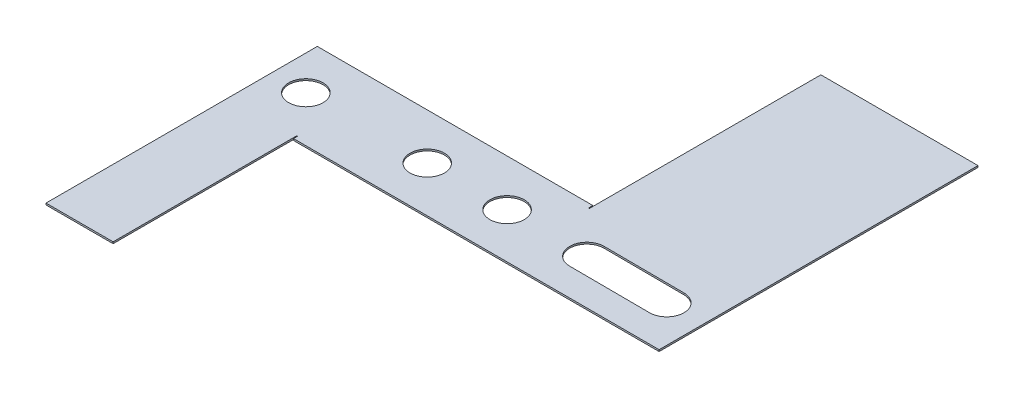
ISO-10303-21;
HEADER;
FILE_DESCRIPTION(('STEP AP214'),'2;1');
FILE_NAME('part.step','',(''),(''),'','','');
FILE_SCHEMA(('AUTOMOTIVE_DESIGN { 1 0 10303 214 1 1 1 1 }'));
ENDSEC;
DATA;
#1=APPLICATION_CONTEXT('core data for automotive mechanical design processes');
#2=APPLICATION_PROTOCOL_DEFINITION('international standard','automotive_design',2000,#1);
#3=PRODUCT_CONTEXT('',#1,'mechanical');
#4=PRODUCT('Part','Part','',(#3));
#5=PRODUCT_RELATED_PRODUCT_CATEGORY('part','',(#4));
#6=PRODUCT_DEFINITION_FORMATION('','',#4);
#7=PRODUCT_DEFINITION_CONTEXT('part definition',#1,'design');
#8=PRODUCT_DEFINITION('design','',#6,#7);
#9=PRODUCT_DEFINITION_SHAPE('','',#8);
#10=(LENGTH_UNIT() NAMED_UNIT(*) SI_UNIT(.MILLI.,.METRE.));
#11=(NAMED_UNIT(*) PLANE_ANGLE_UNIT() SI_UNIT($,.RADIAN.));
#12=(NAMED_UNIT(*) SI_UNIT($,.STERADIAN.) SOLID_ANGLE_UNIT());
#13=UNCERTAINTY_MEASURE_WITH_UNIT(LENGTH_MEASURE(1.E-05),#10,'distance_accuracy_value','');
#14=(GEOMETRIC_REPRESENTATION_CONTEXT(3) GLOBAL_UNCERTAINTY_ASSIGNED_CONTEXT((#13)) GLOBAL_UNIT_ASSIGNED_CONTEXT((#10,
#11,#12)) REPRESENTATION_CONTEXT('',''));
#15=CARTESIAN_POINT('',(0.,0.,0.));
#16=DIRECTION('',(0.,0.,1.));
#17=DIRECTION('',(1.,0.,0.));
#18=AXIS2_PLACEMENT_3D('',#15,#16,#17);
#19=CARTESIAN_POINT('',(10.4742271385243,60.7366,40.));
#20=DIRECTION('',(0.,0.,1.));
#21=DIRECTION('',(0.,-1.,0.));
#22=AXIS2_PLACEMENT_3D('',#19,#20,#21);
#23=PLANE('',#22);
#24=DIRECTION('',(0.,1.,0.));
#25=VECTOR('',#24,1.);
#26=CARTESIAN_POINT('',(10.5818542770486,59.2634,40.));
#27=LINE('',#26,#25);
#28=CARTESIAN_POINT('',(10.5818542770486,59.2634,40.));
#29=VERTEX_POINT('',#28);
#30=CARTESIAN_POINT('',(10.5818542770486,60.,40.));
#31=VERTEX_POINT('',#30);
#32=EDGE_CURVE('E217',#29,#31,#27,.T.);
#33=ORIENTED_EDGE('',*,*,#32,.F.);
#34=DIRECTION('',(1.,0.,0.));
#35=VECTOR('',#34,1.);
#36=CARTESIAN_POINT('',(11.2108271385243,59.2634,40.));
#37=LINE('',#36,#35);
#38=CARTESIAN_POINT('',(170.,59.2634,40.));
#39=VERTEX_POINT('',#38);
#40=EDGE_CURVE('E12',#29,#39,#37,.T.);
#41=ORIENTED_EDGE('',*,*,#40,.T.);
#42=DIRECTION('',(0.,-1.,0.));
#43=VECTOR('',#42,1.);
#44=CARTESIAN_POINT('',(170.,60.,40.));
#45=LINE('',#44,#43);
#46=CARTESIAN_POINT('',(170.,60.,40.));
#47=VERTEX_POINT('',#46);
#48=EDGE_CURVE('E239',#47,#39,#45,.T.);
#49=ORIENTED_EDGE('',*,*,#48,.F.);
#50=DIRECTION('',(1.,0.,0.));
#51=VECTOR('',#50,1.);
#52=CARTESIAN_POINT('',(11.2108271385243,60.,40.));
#53=LINE('',#52,#51);
#54=EDGE_CURVE('E77',#31,#47,#53,.T.);
#55=ORIENTED_EDGE('',*,*,#54,.F.);
#56=EDGE_LOOP('',(#33,#41,#49,#55));
#57=FACE_BOUND('',#56,.T.);
#58=ADVANCED_FACE('F66',(#57),#23,.T.);
#59=CARTESIAN_POINT('',(30.4742271385243,58.5268,0.));
#60=DIRECTION('',(0.,0.,-1.));
#61=DIRECTION('',(0.,1.,0.));
#62=AXIS2_PLACEMENT_3D('',#59,#60,#61);
#63=PLANE('',#62);
#64=DIRECTION('',(1.,0.,0.));
#65=VECTOR('',#64,1.);
#66=CARTESIAN_POINT('',(11.2108271385243,60.,0.));
#67=LINE('',#66,#65);
#68=CARTESIAN_POINT('',(-19.0515457229514,60.,0.));
#69=VERTEX_POINT('',#68);
#70=CARTESIAN_POINT('',(101.1049,60.,0.));
#71=VERTEX_POINT('',#70);
#72=EDGE_CURVE('E266',#69,#71,#67,.T.);
#73=ORIENTED_EDGE('',*,*,#72,.T.);
#74=DIRECTION('',(0.,-1.,0.));
#75=VECTOR('',#74,1.);
#76=CARTESIAN_POINT('',(101.1049,60.,0.));
#77=LINE('',#76,#75);
#78=CARTESIAN_POINT('',(101.1049,59.2634,0.));
#79=VERTEX_POINT('',#78);
#80=EDGE_CURVE('E289',#71,#79,#77,.T.);
#81=ORIENTED_EDGE('',*,*,#80,.T.);
#82=DIRECTION('',(1.,0.,0.));
#83=VECTOR('',#82,1.);
#84=CARTESIAN_POINT('',(11.2108271385243,59.2634,0.));
#85=LINE('',#84,#83);
#86=CARTESIAN_POINT('',(-19.0515457229514,59.2634,0.));
#87=VERTEX_POINT('',#86);
#88=EDGE_CURVE('E70',#87,#79,#85,.T.);
#89=ORIENTED_EDGE('',*,*,#88,.F.);
#90=DIRECTION('',(0.,1.,0.));
#91=VECTOR('',#90,1.);
#92=CARTESIAN_POINT('',(-19.0515457229514,59.2634,0.));
#93=LINE('',#92,#91);
#94=EDGE_CURVE('E267',#87,#69,#93,.T.);
#95=ORIENTED_EDGE('',*,*,#94,.T.);
#96=EDGE_LOOP('',(#73,#81,#89,#95));
#97=FACE_BOUND('',#96,.T.);
#98=ADVANCED_FACE('F304',(#97),#63,.T.);
#99=CARTESIAN_POINT('',(30.,60.,40.));
#100=DIRECTION('',(0.,1.,0.));
#101=DIRECTION('',(-1.,0.,0.));
#102=AXIS2_PLACEMENT_3D('',#99,#100,#101);
#103=PLANE('',#102);
#104=DIRECTION('',(0.,-5.23236669128384E-13,-1.));
#105=VECTOR('',#104,1.);
#106=CARTESIAN_POINT('',(10.2118542770486,59.9999999999993,78.3149457229708));
#107=LINE('',#106,#105);
#108=CARTESIAN_POINT('',(10.2118542770486,60.0000000000202,118.314945722971));
#109=VERTEX_POINT('',#108);
#110=CARTESIAN_POINT('',(10.2118542770486,60.,38.16));
#111=VERTEX_POINT('',#110);
#112=EDGE_CURVE('E104',#109,#111,#107,.T.);
#113=ORIENTED_EDGE('',*,*,#112,.T.);
#114=DIRECTION('',(-1.,0.,0.));
#115=VECTOR('',#114,1.);
#116=CARTESIAN_POINT('',(10.2118542770486,60.,38.16));
#117=LINE('',#116,#115);
#118=CARTESIAN_POINT('',(10.5818542770486,60.,38.16));
#119=VERTEX_POINT('',#118);
#120=EDGE_CURVE('E222',#119,#111,#117,.T.);
#121=ORIENTED_EDGE('',*,*,#120,.F.);
#122=DIRECTION('',(0.,0.,-1.));
#123=VECTOR('',#122,1.);
#124=CARTESIAN_POINT('',(10.5818542770486,60.,40.));
#125=LINE('',#124,#123);
#126=EDGE_CURVE('E757',#31,#119,#125,.T.);
#127=ORIENTED_EDGE('',*,*,#126,.F.);
#128=ORIENTED_EDGE('',*,*,#54,.T.);
#129=DIRECTION('',(3.904092677644E-13,0.,1.));
#130=VECTOR('',#129,1.);
#131=CARTESIAN_POINT('',(170.,60.,-99.0515457229342));
#132=LINE('',#131,#130);
#133=CARTESIAN_POINT('',(170.,60.,-99.0515457229342));
#134=VERTEX_POINT('',#133);
#135=EDGE_CURVE('E242',#134,#47,#132,.T.);
#136=ORIENTED_EDGE('',*,*,#135,.F.);
#137=DIRECTION('',(-1.,0.,0.));
#138=VECTOR('',#137,1.);
#139=CARTESIAN_POINT('',(170.,60.,-99.0515457229342));
#140=LINE('',#139,#138);
#141=CARTESIAN_POINT('',(101.4732,60.,-99.0515457229342));
#142=VERTEX_POINT('',#141);
#143=EDGE_CURVE('E235',#134,#142,#140,.T.);
#144=ORIENTED_EDGE('',*,*,#143,.T.);
#145=DIRECTION('',(0.,0.,-1.));
#146=VECTOR('',#145,1.);
#147=CARTESIAN_POINT('',(101.4732,60.,-99.0515457229342));
#148=LINE('',#147,#146);
#149=CARTESIAN_POINT('',(101.4732,60.,1.8415));
#150=VERTEX_POINT('',#149);
#151=EDGE_CURVE('E259',#150,#142,#148,.T.);
#152=ORIENTED_EDGE('',*,*,#151,.F.);
#153=DIRECTION('',(-1.,0.,0.));
#154=VECTOR('',#153,1.);
#155=CARTESIAN_POINT('',(101.4732,60.,1.8415));
#156=LINE('',#155,#154);
#157=CARTESIAN_POINT('',(101.1049,60.,1.8415));
#158=VERTEX_POINT('',#157);
#159=EDGE_CURVE('E332',#150,#158,#156,.T.);
#160=ORIENTED_EDGE('',*,*,#159,.T.);
#161=DIRECTION('',(0.,0.,-1.));
#162=VECTOR('',#161,1.);
#163=CARTESIAN_POINT('',(101.1049,60.,1.8415));
#164=LINE('',#163,#162);
#165=EDGE_CURVE('E329',#158,#71,#164,.T.);
#166=ORIENTED_EDGE('',*,*,#165,.T.);
#167=ORIENTED_EDGE('',*,*,#72,.F.);
#168=DIRECTION('',(0.,5.23236669128384E-13,1.));
#169=VECTOR('',#168,1.);
#170=CARTESIAN_POINT('',(-19.0515457229514,59.9999999999993,78.3149457229708));
#171=LINE('',#170,#169);
#172=CARTESIAN_POINT('',(-19.0515457229514,60.0000000000202,118.314945722971));
#173=VERTEX_POINT('',#172);
#174=EDGE_CURVE('E276',#69,#173,#171,.T.);
#175=ORIENTED_EDGE('',*,*,#174,.T.);
#176=DIRECTION('',(1.,0.,0.));
#177=VECTOR('',#176,1.);
#178=CARTESIAN_POINT('',(-19.0515457229514,60.0000000000202,118.314945722971));
#179=LINE('',#178,#177);
#180=EDGE_CURVE('E111',#173,#109,#179,.T.);
#181=ORIENTED_EDGE('',*,*,#180,.T.);
#182=EDGE_LOOP('',(#113,#121,#127,#128,#136,#144,#152,#160,#166,#167,#175,#181));
#183=FACE_BOUND('',#182,.T.);
#184=CARTESIAN_POINT('',(-4.05154572295137,60.,20.));
#185=DIRECTION('',(0.,1.,0.));
#186=DIRECTION('',(-1.,0.,0.));
#187=AXIS2_PLACEMENT_3D('',#184,#185,#186);
#188=CIRCLE('',#187,7.5);
#189=CARTESIAN_POINT('',(-11.5515457229514,60.,20.));
#190=VERTEX_POINT('',#189);
#191=EDGE_CURVE('E269',#190,#190,#188,.T.);
#192=ORIENTED_EDGE('',*,*,#191,.F.);
#193=EDGE_LOOP('',(#192));
#194=FACE_BOUND('',#193,.T.);
#195=CARTESIAN_POINT('',(48.9732,60.,20.0930541960112));
#196=DIRECTION('',(0.,1.,0.));
#197=DIRECTION('',(-1.,0.,0.));
#198=AXIS2_PLACEMENT_3D('',#195,#196,#197);
#199=CIRCLE('',#198,7.5);
#200=CARTESIAN_POINT('',(41.4732,60.,20.0930541960112));
#201=VERTEX_POINT('',#200);
#202=EDGE_CURVE('E336',#201,#201,#199,.T.);
#203=ORIENTED_EDGE('',*,*,#202,.F.);
#204=EDGE_LOOP('',(#203));
#205=FACE_BOUND('',#204,.T.);
#206=CARTESIAN_POINT('',(83.9732,60.,20.2791625880335));
#207=DIRECTION('',(0.,1.,0.));
#208=DIRECTION('',(-1.,0.,0.));
#209=AXIS2_PLACEMENT_3D('',#206,#207,#208);
#210=CIRCLE('',#209,7.50000000000001);
#211=CARTESIAN_POINT('',(76.4732,60.,20.2791625880335));
#212=VERTEX_POINT('',#211);
#213=EDGE_CURVE('E339',#212,#212,#210,.T.);
#214=ORIENTED_EDGE('',*,*,#213,.F.);
#215=EDGE_LOOP('',(#214));
#216=FACE_BOUND('',#215,.T.);
#217=CARTESIAN_POINT('',(118.9732,60.,20.4652709800558));
#218=DIRECTION('',(0.,1.,0.));
#219=DIRECTION('',(-1.,0.,0.));
#220=AXIS2_PLACEMENT_3D('',#217,#218,#219);
#221=CIRCLE('',#220,7.5);
#222=CARTESIAN_POINT('',(119.013079805931,60.,12.9653770074));
#223=VERTEX_POINT('',#222);
#224=CARTESIAN_POINT('',(118.933320194069,60.,27.9651649527117));
#225=VERTEX_POINT('',#224);
#226=EDGE_CURVE('E342',#223,#225,#221,.T.);
#227=ORIENTED_EDGE('',*,*,#226,.F.);
#228=DIRECTION('',(-0.999985863020774,0.,-0.00531730745748192));
#229=VECTOR('',#228,1.);
#230=CARTESIAN_POINT('',(119.013079805931,60.,12.9653770074));
#231=LINE('',#230,#229);
#232=CARTESIAN_POINT('',(154.013079805931,60.,13.1514853994224));
#233=VERTEX_POINT('',#232);
#234=EDGE_CURVE('E348',#233,#223,#231,.T.);
#235=ORIENTED_EDGE('',*,*,#234,.F.);
#236=CARTESIAN_POINT('',(153.9732,60.,20.6513793720782));
#237=DIRECTION('',(0.,1.,0.));
#238=DIRECTION('',(-1.,0.,0.));
#239=AXIS2_PLACEMENT_3D('',#236,#237,#238);
#240=CIRCLE('',#239,7.5);
#241=CARTESIAN_POINT('',(153.933320194069,60.,28.151273344734));
#242=VERTEX_POINT('',#241);
#243=EDGE_CURVE('E354',#242,#233,#240,.T.);
#244=ORIENTED_EDGE('',*,*,#243,.F.);
#245=DIRECTION('',(0.999985863020774,0.,0.00531730745748202));
#246=VECTOR('',#245,1.);
#247=CARTESIAN_POINT('',(118.933320194069,60.,27.9651649527117));
#248=LINE('',#247,#246);
#249=EDGE_CURVE('E359',#225,#242,#248,.T.);
#250=ORIENTED_EDGE('',*,*,#249,.F.);
#251=EDGE_LOOP('',(#227,#235,#244,#250));
#252=FACE_BOUND('',#251,.T.);
#253=ADVANCED_FACE('F68',(#183,#194,#205,#216,#252),#103,.T.);
#254=CARTESIAN_POINT('',(11.2108271385243,59.2634,40.));
#255=DIRECTION('',(0.,1.,0.));
#256=DIRECTION('',(-1.,0.,0.));
#257=AXIS2_PLACEMENT_3D('',#254,#255,#256);
#258=PLANE('',#257);
#259=DIRECTION('',(-1.,0.,0.));
#260=VECTOR('',#259,1.);
#261=CARTESIAN_POINT('',(10.2118542770486,59.2634,38.16));
#262=LINE('',#261,#260);
#263=CARTESIAN_POINT('',(10.5818542770486,59.2634,38.16));
#264=VERTEX_POINT('',#263);
#265=CARTESIAN_POINT('',(10.2118542770486,59.2634,38.16));
#266=VERTEX_POINT('',#265);
#267=EDGE_CURVE('E221',#264,#266,#262,.T.);
#268=ORIENTED_EDGE('',*,*,#267,.T.);
#269=DIRECTION('',(0.,-5.23236669128384E-13,-1.));
#270=VECTOR('',#269,1.);
#271=CARTESIAN_POINT('',(10.2118542770486,59.2633999999993,78.3149457229712));
#272=LINE('',#271,#270);
#273=CARTESIAN_POINT('',(10.2118542770486,59.2634000000202,118.314945722971));
#274=VERTEX_POINT('',#273);
#275=EDGE_CURVE('E194',#274,#266,#272,.T.);
#276=ORIENTED_EDGE('',*,*,#275,.F.);
#277=DIRECTION('',(1.,0.,0.));
#278=VECTOR('',#277,1.);
#279=CARTESIAN_POINT('',(-19.0515457229514,59.2634000000202,118.314945722971));
#280=LINE('',#279,#278);
#281=CARTESIAN_POINT('',(-19.0515457229514,59.2634000000202,118.314945722971));
#282=VERTEX_POINT('',#281);
#283=EDGE_CURVE('E281',#282,#274,#280,.T.);
#284=ORIENTED_EDGE('',*,*,#283,.F.);
#285=DIRECTION('',(0.,-5.23236669128384E-13,-1.));
#286=VECTOR('',#285,1.);
#287=CARTESIAN_POINT('',(-19.0515457229514,59.2633999999993,78.3149457229712));
#288=LINE('',#287,#286);
#289=EDGE_CURVE('E286',#87,#282,#288,.F.);
#290=ORIENTED_EDGE('',*,*,#289,.F.);
#291=ORIENTED_EDGE('',*,*,#88,.T.);
#292=DIRECTION('',(0.,0.,-1.));
#293=VECTOR('',#292,1.);
#294=CARTESIAN_POINT('',(101.1049,59.2634,1.8415));
#295=LINE('',#294,#293);
#296=CARTESIAN_POINT('',(101.1049,59.2634,1.8415));
#297=VERTEX_POINT('',#296);
#298=EDGE_CURVE('E243',#297,#79,#295,.T.);
#299=ORIENTED_EDGE('',*,*,#298,.F.);
#300=DIRECTION('',(-1.,0.,0.));
#301=VECTOR('',#300,1.);
#302=CARTESIAN_POINT('',(101.4732,59.2634,1.8415));
#303=LINE('',#302,#301);
#304=CARTESIAN_POINT('',(101.4732,59.2634,1.8415));
#305=VERTEX_POINT('',#304);
#306=EDGE_CURVE('E369',#305,#297,#303,.T.);
#307=ORIENTED_EDGE('',*,*,#306,.F.);
#308=DIRECTION('',(0.,0.,-1.));
#309=VECTOR('',#308,1.);
#310=CARTESIAN_POINT('',(101.4732,59.2634,-99.0515457229342));
#311=LINE('',#310,#309);
#312=CARTESIAN_POINT('',(101.4732,59.2634,-99.0515457229342));
#313=VERTEX_POINT('',#312);
#314=EDGE_CURVE('E236',#305,#313,#311,.T.);
#315=ORIENTED_EDGE('',*,*,#314,.T.);
#316=DIRECTION('',(1.,0.,0.));
#317=VECTOR('',#316,1.);
#318=CARTESIAN_POINT('',(170.,59.2634,-99.0515457229342));
#319=LINE('',#318,#317);
#320=CARTESIAN_POINT('',(170.,59.2634,-99.0515457229342));
#321=VERTEX_POINT('',#320);
#322=EDGE_CURVE('E233',#321,#313,#319,.F.);
#323=ORIENTED_EDGE('',*,*,#322,.F.);
#324=DIRECTION('',(0.,0.,-1.));
#325=VECTOR('',#324,1.);
#326=CARTESIAN_POINT('',(170.,59.2634,-99.0515457229342));
#327=LINE('',#326,#325);
#328=EDGE_CURVE('E230',#321,#39,#327,.F.);
#329=ORIENTED_EDGE('',*,*,#328,.T.);
#330=ORIENTED_EDGE('',*,*,#40,.F.);
#331=DIRECTION('',(0.,0.,-1.));
#332=VECTOR('',#331,1.);
#333=CARTESIAN_POINT('',(10.5818542770486,59.2634,40.));
#334=LINE('',#333,#332);
#335=EDGE_CURVE('E215',#29,#264,#334,.T.);
#336=ORIENTED_EDGE('',*,*,#335,.T.);
#337=EDGE_LOOP('',(#268,#276,#284,#290,#291,#299,#307,#315,#323,#329,#330,#336));
#338=FACE_BOUND('',#337,.T.);
#339=CARTESIAN_POINT('',(-4.05154572295137,59.2634,20.));
#340=DIRECTION('',(0.,1.,0.));
#341=DIRECTION('',(-1.,0.,0.));
#342=AXIS2_PLACEMENT_3D('',#339,#340,#341);
#343=CIRCLE('',#342,7.5);
#344=CARTESIAN_POINT('',(-11.5515457229514,59.2634,20.));
#345=VERTEX_POINT('',#344);
#346=EDGE_CURVE('E263',#345,#345,#343,.T.);
#347=ORIENTED_EDGE('',*,*,#346,.T.);
#348=EDGE_LOOP('',(#347));
#349=FACE_BOUND('',#348,.T.);
#350=CARTESIAN_POINT('',(48.9732,59.2634,20.0930541960112));
#351=DIRECTION('',(0.,1.,0.));
#352=DIRECTION('',(-1.,0.,0.));
#353=AXIS2_PLACEMENT_3D('',#350,#351,#352);
#354=CIRCLE('',#353,7.5);
#355=CARTESIAN_POINT('',(41.4732,59.2634,20.0930541960112));
#356=VERTEX_POINT('',#355);
#357=EDGE_CURVE('E326',#356,#356,#354,.T.);
#358=ORIENTED_EDGE('',*,*,#357,.T.);
#359=EDGE_LOOP('',(#358));
#360=FACE_BOUND('',#359,.T.);
#361=CARTESIAN_POINT('',(83.9732,59.2634,20.2791625880335));
#362=DIRECTION('',(0.,1.,0.));
#363=DIRECTION('',(-1.,0.,0.));
#364=AXIS2_PLACEMENT_3D('',#361,#362,#363);
#365=CIRCLE('',#364,7.50000000000001);
#366=CARTESIAN_POINT('',(76.4732,59.2634,20.2791625880335));
#367=VERTEX_POINT('',#366);
#368=EDGE_CURVE('E323',#367,#367,#365,.T.);
#369=ORIENTED_EDGE('',*,*,#368,.T.);
#370=EDGE_LOOP('',(#369));
#371=FACE_BOUND('',#370,.T.);
#372=DIRECTION('',(-0.999985863020774,0.,-0.00531730745748192));
#373=VECTOR('',#372,1.);
#374=CARTESIAN_POINT('',(30.1462661045686,59.2634,12.4928381559112));
#375=LINE('',#374,#373);
#376=CARTESIAN_POINT('',(154.013079805931,59.2634,13.1514853994224));
#377=VERTEX_POINT('',#376);
#378=CARTESIAN_POINT('',(119.013079805931,59.2634,12.9653770074));
#379=VERTEX_POINT('',#378);
#380=EDGE_CURVE('E319',#377,#379,#375,.T.);
#381=ORIENTED_EDGE('',*,*,#380,.T.);
#382=CARTESIAN_POINT('',(118.9732,59.2634,20.4652709800558));
#383=DIRECTION('',(0.,1.,0.));
#384=DIRECTION('',(-1.,0.,0.));
#385=AXIS2_PLACEMENT_3D('',#382,#383,#384);
#386=CIRCLE('',#385,7.5);
#387=CARTESIAN_POINT('',(118.933320194069,59.2634,27.9651649527117));
#388=VERTEX_POINT('',#387);
#389=EDGE_CURVE('E315',#379,#388,#386,.T.);
#390=ORIENTED_EDGE('',*,*,#389,.T.);
#391=DIRECTION('',(0.999985863020774,0.,0.00531730745748202));
#392=VECTOR('',#391,1.);
#393=CARTESIAN_POINT('',(30.0665064927064,59.2634,27.4926261012228));
#394=LINE('',#393,#392);
#395=CARTESIAN_POINT('',(153.933320194069,59.2634,28.151273344734));
#396=VERTEX_POINT('',#395);
#397=EDGE_CURVE('E309',#388,#396,#394,.T.);
#398=ORIENTED_EDGE('',*,*,#397,.T.);
#399=CARTESIAN_POINT('',(153.9732,59.2634,20.6513793720782));
#400=DIRECTION('',(0.,1.,0.));
#401=DIRECTION('',(-1.,0.,0.));
#402=AXIS2_PLACEMENT_3D('',#399,#400,#401);
#403=CIRCLE('',#402,7.5);
#404=EDGE_CURVE('E305',#396,#377,#403,.T.);
#405=ORIENTED_EDGE('',*,*,#404,.T.);
#406=EDGE_LOOP('',(#381,#390,#398,#405));
#407=FACE_BOUND('',#406,.T.);
#408=ADVANCED_FACE('F226',(#338,#349,#360,#371,#407),#258,.F.);
#409=CARTESIAN_POINT('',(-19.0515457229514,59.9999999999993,78.3149457229708));
#410=DIRECTION('',(-1.,0.,0.));
#411=DIRECTION('',(0.,5.23236669128384E-13,1.));
#412=AXIS2_PLACEMENT_3D('',#409,#410,#411);
#413=PLANE('',#412);
#414=ORIENTED_EDGE('',*,*,#174,.F.);
#415=ORIENTED_EDGE('',*,*,#94,.F.);
#416=ORIENTED_EDGE('',*,*,#289,.T.);
#417=DIRECTION('',(0.,1.,-5.23236669128384E-13));
#418=VECTOR('',#417,1.);
#419=CARTESIAN_POINT('',(-19.0515457229514,60.0000000000202,118.314945722971));
#420=LINE('',#419,#418);
#421=EDGE_CURVE('E284',#173,#282,#420,.F.);
#422=ORIENTED_EDGE('',*,*,#421,.F.);
#423=EDGE_LOOP('',(#414,#415,#416,#422));
#424=FACE_BOUND('',#423,.T.);
#425=ADVANCED_FACE('F395',(#424),#413,.T.);
#426=CARTESIAN_POINT('',(-19.0515457229514,60.0000000000202,118.314945722971));
#427=DIRECTION('',(0.,5.23236669128384E-13,1.));
#428=DIRECTION('',(1.,0.,0.));
#429=AXIS2_PLACEMENT_3D('',#426,#427,#428);
#430=PLANE('',#429);
#431=ORIENTED_EDGE('',*,*,#421,.T.);
#432=ORIENTED_EDGE('',*,*,#283,.T.);
#433=DIRECTION('',(0.,1.,-5.23236669128384E-13));
#434=VECTOR('',#433,1.);
#435=CARTESIAN_POINT('',(10.2118542770486,60.0000000000202,118.314945722971));
#436=LINE('',#435,#434);
#437=EDGE_CURVE('E274',#109,#274,#436,.F.);
#438=ORIENTED_EDGE('',*,*,#437,.F.);
#439=ORIENTED_EDGE('',*,*,#180,.F.);
#440=EDGE_LOOP('',(#431,#432,#438,#439));
#441=FACE_BOUND('',#440,.T.);
#442=ADVANCED_FACE('F402',(#441),#430,.T.);
#443=CARTESIAN_POINT('',(10.2118542770486,59.9999999999993,78.3149457229708));
#444=DIRECTION('',(1.,0.,0.));
#445=DIRECTION('',(0.,-5.23236669128384E-13,-1.));
#446=AXIS2_PLACEMENT_3D('',#443,#444,#445);
#447=PLANE('',#446);
#448=ORIENTED_EDGE('',*,*,#437,.T.);
#449=ORIENTED_EDGE('',*,*,#275,.T.);
#450=DIRECTION('',(0.,1.,0.));
#451=VECTOR('',#450,1.);
#452=CARTESIAN_POINT('',(10.2118542770486,59.2634,38.16));
#453=LINE('',#452,#451);
#454=EDGE_CURVE('E262',#266,#111,#453,.T.);
#455=ORIENTED_EDGE('',*,*,#454,.T.);
#456=ORIENTED_EDGE('',*,*,#112,.F.);
#457=EDGE_LOOP('',(#448,#449,#455,#456));
#458=FACE_BOUND('',#457,.T.);
#459=ADVANCED_FACE('F398',(#458),#447,.T.);
#460=CARTESIAN_POINT('',(-4.05154572295139,19.2634,20.));
#461=DIRECTION('',(0.,1.,0.));
#462=DIRECTION('',(-1.,0.,0.));
#463=AXIS2_PLACEMENT_3D('',#460,#461,#462);
#464=CYLINDRICAL_SURFACE('',#463,7.5);
#465=ORIENTED_EDGE('',*,*,#191,.T.);
#466=EDGE_LOOP('',(#465));
#467=FACE_BOUND('',#466,.T.);
#468=ORIENTED_EDGE('',*,*,#346,.F.);
#469=EDGE_LOOP('',(#468));
#470=FACE_BOUND('',#469,.T.);
#471=ADVANCED_FACE('F385',(#467,#470),#464,.F.);
#472=CARTESIAN_POINT('',(101.4732,60.,-99.0515457229342));
#473=DIRECTION('',(-1.,0.,0.));
#474=DIRECTION('',(0.,0.,-1.));
#475=AXIS2_PLACEMENT_3D('',#472,#473,#474);
#476=PLANE('',#475);
#477=ORIENTED_EDGE('',*,*,#151,.T.);
#478=DIRECTION('',(0.,-1.,0.));
#479=VECTOR('',#478,1.);
#480=CARTESIAN_POINT('',(101.4732,60.,-99.0515457229342));
#481=LINE('',#480,#479);
#482=EDGE_CURVE('E186',#142,#313,#481,.T.);
#483=ORIENTED_EDGE('',*,*,#482,.T.);
#484=ORIENTED_EDGE('',*,*,#314,.F.);
#485=DIRECTION('',(0.,-1.,0.));
#486=VECTOR('',#485,1.);
#487=CARTESIAN_POINT('',(101.4732,60.,1.8415));
#488=LINE('',#487,#486);
#489=EDGE_CURVE('E365',#150,#305,#488,.T.);
#490=ORIENTED_EDGE('',*,*,#489,.F.);
#491=EDGE_LOOP('',(#477,#483,#484,#490));
#492=FACE_BOUND('',#491,.T.);
#493=ADVANCED_FACE('F375',(#492),#476,.T.);
#494=CARTESIAN_POINT('',(170.,60.,-99.0515457229342));
#495=DIRECTION('',(0.,0.,1.));
#496=DIRECTION('',(-1.,0.,0.));
#497=AXIS2_PLACEMENT_3D('',#494,#495,#496);
#498=PLANE('',#497);
#499=ORIENTED_EDGE('',*,*,#482,.F.);
#500=ORIENTED_EDGE('',*,*,#143,.F.);
#501=DIRECTION('',(0.,-1.,0.));
#502=VECTOR('',#501,1.);
#503=CARTESIAN_POINT('',(170.,60.,-99.0515457229342));
#504=LINE('',#503,#502);
#505=EDGE_CURVE('E256',#134,#321,#504,.T.);
#506=ORIENTED_EDGE('',*,*,#505,.T.);
#507=ORIENTED_EDGE('',*,*,#322,.T.);
#508=EDGE_LOOP('',(#499,#500,#506,#507));
#509=FACE_BOUND('',#508,.T.);
#510=ADVANCED_FACE('F377',(#509),#498,.F.);
#511=CARTESIAN_POINT('',(170.,60.,-99.0515457229342));
#512=DIRECTION('',(1.,0.,-3.904092677644E-13));
#513=DIRECTION('',(3.904092677644E-13,0.,1.));
#514=AXIS2_PLACEMENT_3D('',#511,#512,#513);
#515=PLANE('',#514);
#516=ORIENTED_EDGE('',*,*,#505,.F.);
#517=ORIENTED_EDGE('',*,*,#135,.T.);
#518=ORIENTED_EDGE('',*,*,#48,.T.);
#519=ORIENTED_EDGE('',*,*,#328,.F.);
#520=EDGE_LOOP('',(#516,#517,#518,#519));
#521=FACE_BOUND('',#520,.T.);
#522=ADVANCED_FACE('F240',(#521),#515,.T.);
#523=CARTESIAN_POINT('',(101.1049,60.,1.8415));
#524=DIRECTION('',(-1.,0.,0.));
#525=DIRECTION('',(0.,-1.,0.));
#526=AXIS2_PLACEMENT_3D('',#523,#524,#525);
#527=PLANE('',#526);
#528=ORIENTED_EDGE('',*,*,#298,.T.);
#529=ORIENTED_EDGE('',*,*,#80,.F.);
#530=ORIENTED_EDGE('',*,*,#165,.F.);
#531=DIRECTION('',(0.,-1.,0.));
#532=VECTOR('',#531,1.);
#533=CARTESIAN_POINT('',(101.1049,60.,1.8415));
#534=LINE('',#533,#532);
#535=EDGE_CURVE('E247',#158,#297,#534,.T.);
#536=ORIENTED_EDGE('',*,*,#535,.T.);
#537=EDGE_LOOP('',(#528,#529,#530,#536));
#538=FACE_BOUND('',#537,.T.);
#539=ADVANCED_FACE('F300',(#538),#527,.F.);
#540=CARTESIAN_POINT('',(101.4732,60.,1.8415));
#541=DIRECTION('',(0.,0.,1.));
#542=DIRECTION('',(1.,0.,0.));
#543=AXIS2_PLACEMENT_3D('',#540,#541,#542);
#544=PLANE('',#543);
#545=ORIENTED_EDGE('',*,*,#306,.T.);
#546=ORIENTED_EDGE('',*,*,#535,.F.);
#547=ORIENTED_EDGE('',*,*,#159,.F.);
#548=ORIENTED_EDGE('',*,*,#489,.T.);
#549=EDGE_LOOP('',(#545,#546,#547,#548));
#550=FACE_BOUND('',#549,.T.);
#551=ADVANCED_FACE('F372',(#550),#544,.F.);
#552=CARTESIAN_POINT('',(118.933320194069,-0.736600000000025,27.9651649527117));
#553=DIRECTION('',(-0.00531730745748202,0.,0.999985863020774));
#554=DIRECTION('',(0.999985863020774,0.,0.00531730745748202));
#555=AXIS2_PLACEMENT_3D('',#552,#553,#554);
#556=PLANE('',#555);
#557=DIRECTION('',(0.,1.,0.));
#558=VECTOR('',#557,1.);
#559=CARTESIAN_POINT('',(118.933320194069,-0.736600000000025,27.9651649527117));
#560=LINE('',#559,#558);
#561=EDGE_CURVE('E362',#388,#225,#560,.T.);
#562=ORIENTED_EDGE('',*,*,#561,.T.);
#563=ORIENTED_EDGE('',*,*,#249,.T.);
#564=DIRECTION('',(0.,1.,0.));
#565=VECTOR('',#564,1.);
#566=CARTESIAN_POINT('',(153.933320194069,-0.736600000000032,28.151273344734));
#567=LINE('',#566,#565);
#568=EDGE_CURVE('E357',#396,#242,#567,.T.);
#569=ORIENTED_EDGE('',*,*,#568,.F.);
#570=ORIENTED_EDGE('',*,*,#397,.F.);
#571=EDGE_LOOP('',(#562,#563,#569,#570));
#572=FACE_BOUND('',#571,.T.);
#573=ADVANCED_FACE('F428',(#572),#556,.F.);
#574=CARTESIAN_POINT('',(153.9732,-0.736600000000032,20.6513793720782));
#575=DIRECTION('',(0.,1.,0.));
#576=DIRECTION('',(-1.,0.,0.));
#577=AXIS2_PLACEMENT_3D('',#574,#575,#576);
#578=CYLINDRICAL_SURFACE('',#577,7.5);
#579=ORIENTED_EDGE('',*,*,#568,.T.);
#580=ORIENTED_EDGE('',*,*,#243,.T.);
#581=DIRECTION('',(0.,1.,0.));
#582=VECTOR('',#581,1.);
#583=CARTESIAN_POINT('',(154.013079805931,-0.736600000000032,13.1514853994224));
#584=LINE('',#583,#582);
#585=EDGE_CURVE('E352',#377,#233,#584,.T.);
#586=ORIENTED_EDGE('',*,*,#585,.F.);
#587=ORIENTED_EDGE('',*,*,#404,.F.);
#588=EDGE_LOOP('',(#579,#580,#586,#587));
#589=FACE_BOUND('',#588,.T.);
#590=ADVANCED_FACE('F424',(#589),#578,.F.);
#591=CARTESIAN_POINT('',(119.013079805931,-0.736600000000025,12.9653770074));
#592=DIRECTION('',(0.00531730745748192,0.,-0.999985863020774));
#593=DIRECTION('',(-0.999985863020774,0.,-0.00531730745748192));
#594=AXIS2_PLACEMENT_3D('',#591,#592,#593);
#595=PLANE('',#594);
#596=ORIENTED_EDGE('',*,*,#585,.T.);
#597=ORIENTED_EDGE('',*,*,#234,.T.);
#598=DIRECTION('',(0.,1.,0.));
#599=VECTOR('',#598,1.);
#600=CARTESIAN_POINT('',(119.013079805931,-0.736600000000025,12.9653770074));
#601=LINE('',#600,#599);
#602=EDGE_CURVE('E345',#379,#223,#601,.T.);
#603=ORIENTED_EDGE('',*,*,#602,.F.);
#604=ORIENTED_EDGE('',*,*,#380,.F.);
#605=EDGE_LOOP('',(#596,#597,#603,#604));
#606=FACE_BOUND('',#605,.T.);
#607=ADVANCED_FACE('F420',(#606),#595,.F.);
#608=CARTESIAN_POINT('',(118.9732,-0.736600000000025,20.4652709800558));
#609=DIRECTION('',(0.,1.,0.));
#610=DIRECTION('',(-1.,0.,0.));
#611=AXIS2_PLACEMENT_3D('',#608,#609,#610);
#612=CYLINDRICAL_SURFACE('',#611,7.5);
#613=ORIENTED_EDGE('',*,*,#602,.T.);
#614=ORIENTED_EDGE('',*,*,#226,.T.);
#615=ORIENTED_EDGE('',*,*,#561,.F.);
#616=ORIENTED_EDGE('',*,*,#389,.F.);
#617=EDGE_LOOP('',(#613,#614,#615,#616));
#618=FACE_BOUND('',#617,.T.);
#619=ADVANCED_FACE('F416',(#618),#612,.F.);
#620=CARTESIAN_POINT('',(83.9732,-0.736600000000018,20.2791625880335));
#621=DIRECTION('',(0.,1.,0.));
#622=DIRECTION('',(-1.,0.,0.));
#623=AXIS2_PLACEMENT_3D('',#620,#621,#622);
#624=CYLINDRICAL_SURFACE('',#623,7.50000000000001);
#625=ORIENTED_EDGE('',*,*,#213,.T.);
#626=EDGE_LOOP('',(#625));
#627=FACE_BOUND('',#626,.T.);
#628=ORIENTED_EDGE('',*,*,#368,.F.);
#629=EDGE_LOOP('',(#628));
#630=FACE_BOUND('',#629,.T.);
#631=ADVANCED_FACE('F412',(#627,#630),#624,.F.);
#632=CARTESIAN_POINT('',(48.9732,-0.736600000000011,20.0930541960112));
#633=DIRECTION('',(0.,1.,0.));
#634=DIRECTION('',(-1.,0.,0.));
#635=AXIS2_PLACEMENT_3D('',#632,#633,#634);
#636=CYLINDRICAL_SURFACE('',#635,7.5);
#637=ORIENTED_EDGE('',*,*,#202,.T.);
#638=EDGE_LOOP('',(#637));
#639=FACE_BOUND('',#638,.T.);
#640=ORIENTED_EDGE('',*,*,#357,.F.);
#641=EDGE_LOOP('',(#640));
#642=FACE_BOUND('',#641,.T.);
#643=ADVANCED_FACE('F408',(#639,#642),#636,.F.);
#644=CARTESIAN_POINT('',(10.2118542770486,59.2634,38.16));
#645=DIRECTION('',(0.,0.,-1.));
#646=DIRECTION('',(-1.,0.,0.));
#647=AXIS2_PLACEMENT_3D('',#644,#645,#646);
#648=PLANE('',#647);
#649=ORIENTED_EDGE('',*,*,#120,.T.);
#650=ORIENTED_EDGE('',*,*,#454,.F.);
#651=ORIENTED_EDGE('',*,*,#267,.F.);
#652=DIRECTION('',(0.,1.,0.));
#653=VECTOR('',#652,1.);
#654=CARTESIAN_POINT('',(10.5818542770486,59.2634,38.16));
#655=LINE('',#654,#653);
#656=EDGE_CURVE('E208',#264,#119,#655,.T.);
#657=ORIENTED_EDGE('',*,*,#656,.T.);
#658=EDGE_LOOP('',(#649,#650,#651,#657));
#659=FACE_BOUND('',#658,.T.);
#660=ADVANCED_FACE('F411',(#659),#648,.F.);
#661=CARTESIAN_POINT('',(10.5818542770486,59.2634,40.));
#662=DIRECTION('',(1.,0.,0.));
#663=DIRECTION('',(0.,1.,0.));
#664=AXIS2_PLACEMENT_3D('',#661,#662,#663);
#665=PLANE('',#664);
#666=ORIENTED_EDGE('',*,*,#126,.T.);
#667=ORIENTED_EDGE('',*,*,#656,.F.);
#668=ORIENTED_EDGE('',*,*,#335,.F.);
#669=ORIENTED_EDGE('',*,*,#32,.T.);
#670=EDGE_LOOP('',(#666,#667,#668,#669));
#671=FACE_BOUND('',#670,.T.);
#672=ADVANCED_FACE('F216',(#671),#665,.F.);
#673=CLOSED_SHELL('',(#58,#98,#253,#408,#425,#442,#459,#471,#493,#510,#522,#539,#551,#573,#590,
#607,#619,#631,#643,#660,#672));
#674=MANIFOLD_SOLID_BREP('B2',#673);
#675=ADVANCED_BREP_SHAPE_REPRESENTATION('',(#18,#674),#14);
#676=SHAPE_DEFINITION_REPRESENTATION(#9,#675);
ENDSEC;
END-ISO-10303-21;
